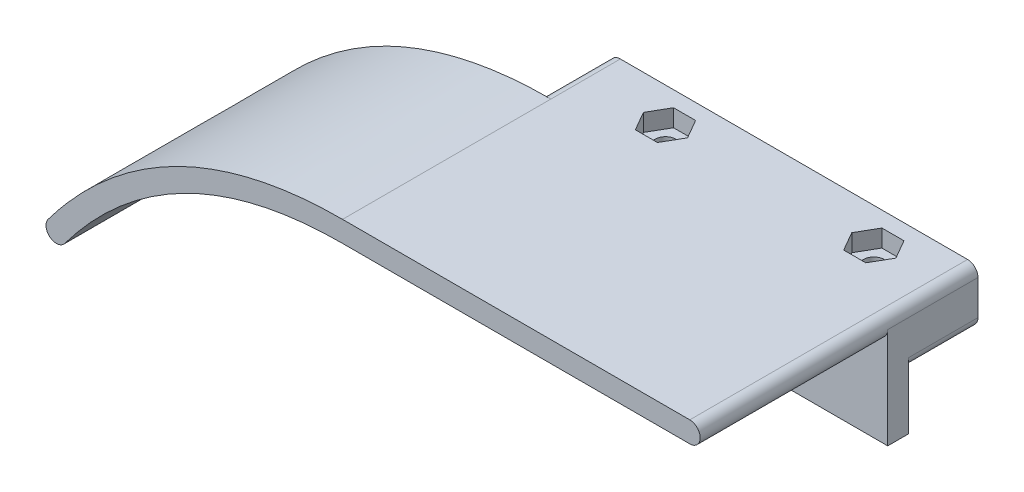
ISO-10303-21;
HEADER;
FILE_DESCRIPTION(('STEP AP214'),'2;1');
FILE_NAME('part.step','',(''),(''),'','','');
FILE_SCHEMA(('AUTOMOTIVE_DESIGN { 1 0 10303 214 1 1 1 1 }'));
ENDSEC;
DATA;
#1=APPLICATION_CONTEXT('core data for automotive mechanical design processes');
#2=APPLICATION_PROTOCOL_DEFINITION('international standard','automotive_design',2000,#1);
#3=PRODUCT_CONTEXT('',#1,'mechanical');
#4=PRODUCT('Part','Part','',(#3));
#5=PRODUCT_RELATED_PRODUCT_CATEGORY('part','',(#4));
#6=PRODUCT_DEFINITION_FORMATION('','',#4);
#7=PRODUCT_DEFINITION_CONTEXT('part definition',#1,'design');
#8=PRODUCT_DEFINITION('design','',#6,#7);
#9=PRODUCT_DEFINITION_SHAPE('','',#8);
#10=(LENGTH_UNIT() NAMED_UNIT(*) SI_UNIT(.MILLI.,.METRE.));
#11=(NAMED_UNIT(*) PLANE_ANGLE_UNIT() SI_UNIT($,.RADIAN.));
#12=(NAMED_UNIT(*) SI_UNIT($,.STERADIAN.) SOLID_ANGLE_UNIT());
#13=UNCERTAINTY_MEASURE_WITH_UNIT(LENGTH_MEASURE(1.E-05),#10,'distance_accuracy_value','');
#14=(GEOMETRIC_REPRESENTATION_CONTEXT(3) GLOBAL_UNCERTAINTY_ASSIGNED_CONTEXT((#13)) GLOBAL_UNIT_ASSIGNED_CONTEXT((#10,
#11,#12)) REPRESENTATION_CONTEXT('',''));
#15=CARTESIAN_POINT('',(0.,0.,0.));
#16=DIRECTION('',(0.,0.,1.));
#17=DIRECTION('',(1.,0.,0.));
#18=AXIS2_PLACEMENT_3D('',#15,#16,#17);
#19=CARTESIAN_POINT('',(-25.,1.5,30.));
#20=DIRECTION('',(0.,1.,0.));
#21=DIRECTION('',(0.,0.,1.));
#22=AXIS2_PLACEMENT_3D('',#19,#20,#21);
#23=PLANE('',#22);
#24=DIRECTION('',(1.,0.,0.));
#25=VECTOR('',#24,1.);
#26=CARTESIAN_POINT('',(-25.,1.5,-7.75000000000001));
#27=LINE('',#26,#25);
#28=CARTESIAN_POINT('',(14.9122867597285,1.5,-7.75));
#29=VERTEX_POINT('',#28);
#30=CARTESIAN_POINT('',(18.0877132402715,1.5,-7.75));
#31=VERTEX_POINT('',#30);
#32=EDGE_CURVE('E496',#29,#31,#27,.T.);
#33=ORIENTED_EDGE('',*,*,#32,.T.);
#34=DIRECTION('',(0.5,0.,0.866025403784438));
#35=VECTOR('',#34,1.);
#36=CARTESIAN_POINT('',(23.6620144266348,1.5,1.90497287147287));
#37=LINE('',#36,#35);
#38=CARTESIAN_POINT('',(19.6754264805429,1.5,-5.));
#39=VERTEX_POINT('',#38);
#40=EDGE_CURVE('E499',#31,#39,#37,.T.);
#41=ORIENTED_EDGE('',*,*,#40,.T.);
#42=DIRECTION('',(-0.499999999999999,0.,0.866025403784439));
#43=VECTOR('',#42,1.);
#44=CARTESIAN_POINT('',(-6.64887470582043,1.5,40.5950271285271));
#45=LINE('',#44,#43);
#46=CARTESIAN_POINT('',(18.0877132402715,1.5,-2.25));
#47=VERTEX_POINT('',#46);
#48=EDGE_CURVE('E480',#39,#47,#45,.T.);
#49=ORIENTED_EDGE('',*,*,#48,.T.);
#50=DIRECTION('',(-1.,0.,0.));
#51=VECTOR('',#50,1.);
#52=CARTESIAN_POINT('',(-25.,1.5,-2.24999999999999));
#53=LINE('',#52,#51);
#54=CARTESIAN_POINT('',(14.9122867597285,1.5,-2.25));
#55=VERTEX_POINT('',#54);
#56=EDGE_CURVE('E487',#47,#55,#53,.T.);
#57=ORIENTED_EDGE('',*,*,#56,.T.);
#58=DIRECTION('',(-0.5,0.,-0.866025403784439));
#59=VECTOR('',#58,1.);
#60=CARTESIAN_POINT('',(18.8988747058204,1.5,4.65497287147289));
#61=LINE('',#60,#59);
#62=CARTESIAN_POINT('',(13.324573519457,1.5,-5.));
#63=VERTEX_POINT('',#62);
#64=EDGE_CURVE('E490',#55,#63,#61,.T.);
#65=ORIENTED_EDGE('',*,*,#64,.T.);
#66=DIRECTION('',(0.5,0.,-0.866025403784439));
#67=VECTOR('',#66,1.);
#68=CARTESIAN_POINT('',(-11.4120144266349,1.5,37.8450271285271));
#69=LINE('',#68,#67);
#70=EDGE_CURVE('E493',#63,#29,#69,.T.);
#71=ORIENTED_EDGE('',*,*,#70,.T.);
#72=EDGE_LOOP('',(#33,#41,#49,#57,#65,#71));
#73=FACE_BOUND('',#72,.T.);
#74=DIRECTION('',(0.,0.,-1.));
#75=VECTOR('',#74,1.);
#76=CARTESIAN_POINT('',(25.,1.5,30.));
#77=LINE('',#76,#75);
#78=CARTESIAN_POINT('',(25.,1.5,30.));
#79=VERTEX_POINT('',#78);
#80=CARTESIAN_POINT('',(25.,1.5,-10.));
#81=VERTEX_POINT('',#80);
#82=EDGE_CURVE('E461',#79,#81,#77,.T.);
#83=ORIENTED_EDGE('',*,*,#82,.T.);
#84=DIRECTION('',(1.,0.,0.));
#85=VECTOR('',#84,1.);
#86=CARTESIAN_POINT('',(25.,1.5,-10.));
#87=LINE('',#86,#85);
#88=CARTESIAN_POINT('',(-25.,1.5,-10.));
#89=VERTEX_POINT('',#88);
#90=EDGE_CURVE('E337',#89,#81,#87,.T.);
#91=ORIENTED_EDGE('',*,*,#90,.F.);
#92=DIRECTION('',(0.,0.,1.));
#93=VECTOR('',#92,1.);
#94=CARTESIAN_POINT('',(-25.,1.5,-10.));
#95=LINE('',#94,#93);
#96=CARTESIAN_POINT('',(-25.,1.5,0.));
#97=VERTEX_POINT('',#96);
#98=EDGE_CURVE('E340',#89,#97,#95,.T.);
#99=ORIENTED_EDGE('',*,*,#98,.T.);
#100=DIRECTION('',(0.,0.,-1.));
#101=VECTOR('',#100,1.);
#102=CARTESIAN_POINT('',(-25.,1.5,30.));
#103=LINE('',#102,#101);
#104=CARTESIAN_POINT('',(-25.,1.5,30.));
#105=VERTEX_POINT('',#104);
#106=EDGE_CURVE('E450',#105,#97,#103,.T.);
#107=ORIENTED_EDGE('',*,*,#106,.F.);
#108=DIRECTION('',(1.,0.,0.));
#109=VECTOR('',#108,1.);
#110=CARTESIAN_POINT('',(-25.,1.5,30.));
#111=LINE('',#110,#109);
#112=EDGE_CURVE('E447',#105,#79,#111,.T.);
#113=ORIENTED_EDGE('',*,*,#112,.T.);
#114=EDGE_LOOP('',(#83,#91,#99,#107,#113));
#115=FACE_BOUND('',#114,.T.);
#116=DIRECTION('',(1.,0.,0.));
#117=VECTOR('',#116,1.);
#118=CARTESIAN_POINT('',(-25.,1.5,-7.75));
#119=LINE('',#118,#117);
#120=CARTESIAN_POINT('',(-15.0877132402715,1.5,-7.75));
#121=VERTEX_POINT('',#120);
#122=CARTESIAN_POINT('',(-11.9122867597285,1.5,-7.75));
#123=VERTEX_POINT('',#122);
#124=EDGE_CURVE('E514',#121,#123,#119,.T.);
#125=ORIENTED_EDGE('',*,*,#124,.T.);
#126=DIRECTION('',(0.5,0.,0.866025403784439));
#127=VECTOR('',#126,1.);
#128=CARTESIAN_POINT('',(1.16201442663487,1.5,14.8953539282395));
#129=LINE('',#128,#127);
#130=CARTESIAN_POINT('',(-10.3245735194571,1.5,-5.00000000000001));
#131=VERTEX_POINT('',#130);
#132=EDGE_CURVE('E238',#123,#131,#129,.T.);
#133=ORIENTED_EDGE('',*,*,#132,.T.);
#134=DIRECTION('',(-0.5,0.,0.866025403784439));
#135=VECTOR('',#134,1.);
#136=CARTESIAN_POINT('',(-29.1488747058205,1.5,27.6046460717605));
#137=LINE('',#136,#135);
#138=CARTESIAN_POINT('',(-11.9122867597285,1.5,-2.25));
#139=VERTEX_POINT('',#138);
#140=EDGE_CURVE('E502',#131,#139,#137,.T.);
#141=ORIENTED_EDGE('',*,*,#140,.T.);
#142=DIRECTION('',(-1.,0.,0.));
#143=VECTOR('',#142,1.);
#144=CARTESIAN_POINT('',(-25.,1.5,-2.25));
#145=LINE('',#144,#143);
#146=CARTESIAN_POINT('',(-15.0877132402715,1.5,-2.25));
#147=VERTEX_POINT('',#146);
#148=EDGE_CURVE('E505',#139,#147,#145,.T.);
#149=ORIENTED_EDGE('',*,*,#148,.T.);
#150=DIRECTION('',(-0.5,0.,-0.866025403784439));
#151=VECTOR('',#150,1.);
#152=CARTESIAN_POINT('',(-3.60112529417956,1.5,17.6453539282395));
#153=LINE('',#152,#151);
#154=CARTESIAN_POINT('',(-16.675426480543,1.5,-5.));
#155=VERTEX_POINT('',#154);
#156=EDGE_CURVE('E508',#147,#155,#153,.T.);
#157=ORIENTED_EDGE('',*,*,#156,.T.);
#158=DIRECTION('',(0.5,0.,-0.866025403784439));
#159=VECTOR('',#158,1.);
#160=CARTESIAN_POINT('',(-33.9120144266349,1.5,24.8546460717605));
#161=LINE('',#160,#159);
#162=EDGE_CURVE('E511',#155,#121,#161,.T.);
#163=ORIENTED_EDGE('',*,*,#162,.T.);
#164=EDGE_LOOP('',(#125,#133,#141,#149,#157,#163));
#165=FACE_BOUND('',#164,.T.);
#166=ADVANCED_FACE('F39',(#73,#115,#165),#23,.T.);
#167=CARTESIAN_POINT('',(16.5,-22.1,-5.));
#168=DIRECTION('',(0.,1.,0.));
#169=DIRECTION('',(0.,0.,1.));
#170=AXIS2_PLACEMENT_3D('',#167,#168,#169);
#171=CYLINDRICAL_SURFACE('',#170,1.5);
#172=CARTESIAN_POINT('',(16.5,-6.5,-5.));
#173=DIRECTION('',(0.,1.,0.));
#174=DIRECTION('',(0.,0.,1.));
#175=AXIS2_PLACEMENT_3D('',#172,#173,#174);
#176=CIRCLE('',#175,1.5);
#177=CARTESIAN_POINT('',(16.5,-6.5,-3.5));
#178=VERTEX_POINT('',#177);
#179=EDGE_CURVE('E320',#178,#178,#176,.T.);
#180=ORIENTED_EDGE('',*,*,#179,.F.);
#181=EDGE_LOOP('',(#180));
#182=FACE_BOUND('',#181,.T.);
#183=CARTESIAN_POINT('',(16.5,-1.,-5.));
#184=DIRECTION('',(0.,1.,0.));
#185=DIRECTION('',(0.,0.,1.));
#186=AXIS2_PLACEMENT_3D('',#183,#184,#185);
#187=CIRCLE('',#186,1.5);
#188=CARTESIAN_POINT('',(16.5,-1.,-3.5));
#189=VERTEX_POINT('',#188);
#190=EDGE_CURVE('E310',#189,#189,#187,.F.);
#191=ORIENTED_EDGE('',*,*,#190,.F.);
#192=EDGE_LOOP('',(#191));
#193=FACE_BOUND('',#192,.T.);
#194=ADVANCED_FACE('F561',(#182,#193),#171,.F.);
#195=CARTESIAN_POINT('',(-13.5,-22.1,-5.));
#196=DIRECTION('',(0.,1.,0.));
#197=DIRECTION('',(0.,0.,1.));
#198=AXIS2_PLACEMENT_3D('',#195,#196,#197);
#199=CYLINDRICAL_SURFACE('',#198,1.5);
#200=CARTESIAN_POINT('',(-13.5,-6.5,-5.));
#201=DIRECTION('',(0.,1.,0.));
#202=DIRECTION('',(0.,0.,1.));
#203=AXIS2_PLACEMENT_3D('',#200,#201,#202);
#204=CIRCLE('',#203,1.5);
#205=CARTESIAN_POINT('',(-13.5,-6.5,-3.5));
#206=VERTEX_POINT('',#205);
#207=EDGE_CURVE('E345',#206,#206,#204,.T.);
#208=ORIENTED_EDGE('',*,*,#207,.F.);
#209=EDGE_LOOP('',(#208));
#210=FACE_BOUND('',#209,.T.);
#211=CARTESIAN_POINT('',(-13.5,-1.,-5.));
#212=DIRECTION('',(0.,1.,0.));
#213=DIRECTION('',(0.,0.,1.));
#214=AXIS2_PLACEMENT_3D('',#211,#212,#213);
#215=CIRCLE('',#214,1.5);
#216=CARTESIAN_POINT('',(-13.5,-1.,-3.5));
#217=VERTEX_POINT('',#216);
#218=EDGE_CURVE('E241',#217,#217,#215,.F.);
#219=ORIENTED_EDGE('',*,*,#218,.F.);
#220=EDGE_LOOP('',(#219));
#221=FACE_BOUND('',#220,.T.);
#222=ADVANCED_FACE('F427',(#210,#221),#199,.F.);
#223=CARTESIAN_POINT('',(-66.2,-20.6,30.));
#224=DIRECTION('',(0.,0.,-1.));
#225=DIRECTION('',(-1.,0.,0.));
#226=AXIS2_PLACEMENT_3D('',#223,#224,#225);
#227=CYLINDRICAL_SURFACE('',#226,1.5);
#228=CARTESIAN_POINT('',(-66.2,-20.6,3.));
#229=DIRECTION('',(0.,0.,-1.));
#230=DIRECTION('',(-1.,0.,0.));
#231=AXIS2_PLACEMENT_3D('',#228,#229,#230);
#232=CIRCLE('',#231,1.5);
#233=CARTESIAN_POINT('',(-65.,-21.5,3.));
#234=VERTEX_POINT('',#233);
#235=CARTESIAN_POINT('',(-66.2,-22.1,3.));
#236=VERTEX_POINT('',#235);
#237=EDGE_CURVE('E398',#234,#236,#232,.T.);
#238=ORIENTED_EDGE('',*,*,#237,.F.);
#239=DIRECTION('',(0.,0.,-1.));
#240=VECTOR('',#239,1.);
#241=CARTESIAN_POINT('',(-65.,-21.5,30.));
#242=LINE('',#241,#240);
#243=CARTESIAN_POINT('',(-65.,-21.5,30.));
#244=VERTEX_POINT('',#243);
#245=EDGE_CURVE('E469',#244,#234,#242,.T.);
#246=ORIENTED_EDGE('',*,*,#245,.F.);
#247=CARTESIAN_POINT('',(-66.2,-20.6,30.));
#248=DIRECTION('',(0.,0.,1.));
#249=DIRECTION('',(1.,0.,0.));
#250=AXIS2_PLACEMENT_3D('',#247,#248,#249);
#251=CIRCLE('',#250,1.5);
#252=CARTESIAN_POINT('',(-67.4,-19.7,30.));
#253=VERTEX_POINT('',#252);
#254=EDGE_CURVE('E411',#253,#244,#251,.T.);
#255=ORIENTED_EDGE('',*,*,#254,.F.);
#256=DIRECTION('',(0.,0.,-1.));
#257=VECTOR('',#256,1.);
#258=CARTESIAN_POINT('',(-67.4,-19.7,30.));
#259=LINE('',#258,#257);
#260=CARTESIAN_POINT('',(-67.4,-19.7,0.));
#261=VERTEX_POINT('',#260);
#262=EDGE_CURVE('E472',#253,#261,#259,.T.);
#263=ORIENTED_EDGE('',*,*,#262,.T.);
#264=CARTESIAN_POINT('',(-66.2,-20.6,0.));
#265=DIRECTION('',(0.,0.,1.));
#266=DIRECTION('',(1.,0.,0.));
#267=AXIS2_PLACEMENT_3D('',#264,#265,#266);
#268=CIRCLE('',#267,1.5);
#269=CARTESIAN_POINT('',(-66.2,-22.1,0.));
#270=VERTEX_POINT('',#269);
#271=EDGE_CURVE('E412',#261,#270,#268,.T.);
#272=ORIENTED_EDGE('',*,*,#271,.T.);
#273=DIRECTION('',(0.,0.,-1.));
#274=VECTOR('',#273,1.);
#275=CARTESIAN_POINT('',(-66.2,-22.1,3.));
#276=LINE('',#275,#274);
#277=EDGE_CURVE('E384',#236,#270,#276,.T.);
#278=ORIENTED_EDGE('',*,*,#277,.F.);
#279=EDGE_LOOP('',(#238,#246,#255,#263,#272,#278));
#280=FACE_BOUND('',#279,.T.);
#281=ADVANCED_FACE('F423',(#280),#227,.T.);
#282=CARTESIAN_POINT('',(-25.,-1.5,30.));
#283=CARTESIAN_POINT('',(-50.,-1.5,30.));
#284=CARTESIAN_POINT('',(-65.,-21.5,30.));
#285=B_SPLINE_CURVE_WITH_KNOTS('',2,(#282,#283,#284),.UNSPECIFIED.,.F.,.F.,(3,3),(0.,1.),.UNSPECIFIED.);
#286=DIRECTION('',(0.,0.,-1.));
#287=VECTOR('',#286,1.);
#288=SURFACE_OF_LINEAR_EXTRUSION('',#285,#287);
#289=ORIENTED_EDGE('',*,*,#245,.T.);
#290=CARTESIAN_POINT('',(-25.,-1.5,3.));
#291=CARTESIAN_POINT('',(-50.,-1.5,3.));
#292=CARTESIAN_POINT('',(-65.,-21.5,3.));
#293=B_SPLINE_CURVE_WITH_KNOTS('',2,(#290,#291,#292),.UNSPECIFIED.,.F.,.F.,(3,3),(0.,1.),.UNSPECIFIED.);
#294=CARTESIAN_POINT('',(-25.,-1.5,3.));
#295=VERTEX_POINT('',#294);
#296=EDGE_CURVE('E393',#234,#295,#293,.F.);
#297=ORIENTED_EDGE('',*,*,#296,.T.);
#298=DIRECTION('',(0.,0.,-1.));
#299=VECTOR('',#298,1.);
#300=CARTESIAN_POINT('',(-25.,-1.5,30.));
#301=LINE('',#300,#299);
#302=CARTESIAN_POINT('',(-25.,-1.5,30.));
#303=VERTEX_POINT('',#302);
#304=EDGE_CURVE('E466',#303,#295,#301,.T.);
#305=ORIENTED_EDGE('',*,*,#304,.F.);
#306=EDGE_CURVE('E433',#303,#244,#285,.T.);
#307=ORIENTED_EDGE('',*,*,#306,.T.);
#308=EDGE_LOOP('',(#289,#297,#305,#307));
#309=FACE_BOUND('',#308,.T.);
#310=ADVANCED_FACE('F426',(#309),#288,.T.);
#311=CARTESIAN_POINT('',(-25.,-1.5,30.));
#312=DIRECTION('',(0.,1.,0.));
#313=DIRECTION('',(0.,0.,1.));
#314=AXIS2_PLACEMENT_3D('',#311,#312,#313);
#315=PLANE('',#314);
#316=DIRECTION('',(-1.,0.,0.));
#317=VECTOR('',#316,1.);
#318=CARTESIAN_POINT('',(-25.,-1.5,3.));
#319=LINE('',#318,#317);
#320=CARTESIAN_POINT('',(25.,-1.5,3.));
#321=VERTEX_POINT('',#320);
#322=EDGE_CURVE('E391',#321,#295,#319,.T.);
#323=ORIENTED_EDGE('',*,*,#322,.F.);
#324=DIRECTION('',(0.,0.,-1.));
#325=VECTOR('',#324,1.);
#326=CARTESIAN_POINT('',(25.,-1.5,30.));
#327=LINE('',#326,#325);
#328=CARTESIAN_POINT('',(25.,-1.5,30.));
#329=VERTEX_POINT('',#328);
#330=EDGE_CURVE('E463',#329,#321,#327,.T.);
#331=ORIENTED_EDGE('',*,*,#330,.F.);
#332=DIRECTION('',(1.,0.,0.));
#333=VECTOR('',#332,1.);
#334=CARTESIAN_POINT('',(-25.,-1.5,30.));
#335=LINE('',#334,#333);
#336=EDGE_CURVE('E439',#303,#329,#335,.T.);
#337=ORIENTED_EDGE('',*,*,#336,.F.);
#338=ORIENTED_EDGE('',*,*,#304,.T.);
#339=EDGE_LOOP('',(#323,#331,#337,#338));
#340=FACE_BOUND('',#339,.T.);
#341=ADVANCED_FACE('F421',(#340),#315,.F.);
#342=CARTESIAN_POINT('',(-25.,1.5,30.));
#343=CARTESIAN_POINT('',(-34.8412354794874,1.51154344161024,30.));
#344=CARTESIAN_POINT('',(-49.0088348649895,-3.4823302700211,30.));
#345=CARTESIAN_POINT('',(-61.5044934655958,-11.820085551444,30.));
#346=CARTESIAN_POINT('',(-67.4,-19.7,30.));
#347=B_SPLINE_CURVE_WITH_KNOTS('',2,(#342,#343,#344,#345,#346),.UNSPECIFIED.,.F.,.F.,(3,1,1,3),
(0.,0.375,0.625,1.),.UNSPECIFIED.);
#348=DIRECTION('',(0.,0.,-1.));
#349=VECTOR('',#348,1.);
#350=SURFACE_OF_LINEAR_EXTRUSION('',#347,#349);
#351=CARTESIAN_POINT('',(-25.,1.5,0.));
#352=CARTESIAN_POINT('',(-34.8412354794874,1.51154344161024,0.));
#353=CARTESIAN_POINT('',(-49.0088348649895,-3.4823302700211,0.));
#354=CARTESIAN_POINT('',(-61.5044934655958,-11.820085551444,0.));
#355=CARTESIAN_POINT('',(-67.4,-19.7,0.));
#356=B_SPLINE_CURVE_WITH_KNOTS('',2,(#351,#352,#353,#354,#355),.UNSPECIFIED.,.F.,.F.,(3,1,1,3),
(0.,0.375,0.625,1.),.UNSPECIFIED.);
#357=EDGE_CURVE('E404',#97,#261,#356,.T.);
#358=ORIENTED_EDGE('',*,*,#357,.T.);
#359=ORIENTED_EDGE('',*,*,#262,.F.);
#360=EDGE_CURVE('E405',#105,#253,#347,.T.);
#361=ORIENTED_EDGE('',*,*,#360,.F.);
#362=ORIENTED_EDGE('',*,*,#106,.T.);
#363=EDGE_LOOP('',(#358,#359,#361,#362));
#364=FACE_BOUND('',#363,.T.);
#365=ADVANCED_FACE('F417',(#364),#350,.F.);
#366=CARTESIAN_POINT('',(25.,0.,30.));
#367=DIRECTION('',(0.,0.,-1.));
#368=DIRECTION('',(-1.,0.,0.));
#369=AXIS2_PLACEMENT_3D('',#366,#367,#368);
#370=CYLINDRICAL_SURFACE('',#369,1.5);
#371=DIRECTION('',(0.,0.,-1.));
#372=VECTOR('',#371,1.);
#373=CARTESIAN_POINT('',(26.5,0.,3.));
#374=LINE('',#373,#372);
#375=CARTESIAN_POINT('',(26.5,0.,3.));
#376=VERTEX_POINT('',#375);
#377=CARTESIAN_POINT('',(26.5,0.,-10.));
#378=VERTEX_POINT('',#377);
#379=EDGE_CURVE('E380',#376,#378,#374,.T.);
#380=ORIENTED_EDGE('',*,*,#379,.T.);
#381=CARTESIAN_POINT('',(25.,0.,-10.));
#382=DIRECTION('',(0.,0.,-1.));
#383=DIRECTION('',(-1.,0.,0.));
#384=AXIS2_PLACEMENT_3D('',#381,#382,#383);
#385=CIRCLE('',#384,1.5);
#386=EDGE_CURVE('E321',#81,#378,#385,.T.);
#387=ORIENTED_EDGE('',*,*,#386,.F.);
#388=ORIENTED_EDGE('',*,*,#82,.F.);
#389=CARTESIAN_POINT('',(25.,0.,30.));
#390=DIRECTION('',(0.,0.,-1.));
#391=DIRECTION('',(-1.,0.,0.));
#392=AXIS2_PLACEMENT_3D('',#389,#390,#391);
#393=CIRCLE('',#392,1.5);
#394=EDGE_CURVE('E444',#79,#329,#393,.T.);
#395=ORIENTED_EDGE('',*,*,#394,.T.);
#396=ORIENTED_EDGE('',*,*,#330,.T.);
#397=CARTESIAN_POINT('',(25.,0.,3.));
#398=DIRECTION('',(0.,0.,-1.));
#399=DIRECTION('',(-1.,0.,0.));
#400=AXIS2_PLACEMENT_3D('',#397,#398,#399);
#401=CIRCLE('',#400,1.5);
#402=EDGE_CURVE('E387',#321,#376,#401,.F.);
#403=ORIENTED_EDGE('',*,*,#402,.T.);
#404=EDGE_LOOP('',(#380,#387,#388,#395,#396,#403));
#405=FACE_BOUND('',#404,.T.);
#406=ADVANCED_FACE('F420',(#405),#370,.T.);
#407=CARTESIAN_POINT('',(-48.8416407864999,-3.81671842700025,30.));
#408=DIRECTION('',(0.,0.,-1.));
#409=DIRECTION('',(-1.,0.,0.));
#410=AXIS2_PLACEMENT_3D('',#407,#408,#409);
#411=PLANE('',#410);
#412=ORIENTED_EDGE('',*,*,#360,.T.);
#413=ORIENTED_EDGE('',*,*,#254,.T.);
#414=ORIENTED_EDGE('',*,*,#306,.F.);
#415=ORIENTED_EDGE('',*,*,#336,.T.);
#416=ORIENTED_EDGE('',*,*,#394,.F.);
#417=ORIENTED_EDGE('',*,*,#112,.F.);
#418=EDGE_LOOP('',(#412,#413,#414,#415,#416,#417));
#419=FACE_BOUND('',#418,.T.);
#420=ADVANCED_FACE('F573',(#419),#411,.F.);
#421=CARTESIAN_POINT('',(-48.8416407864999,-3.81671842700025,0.));
#422=DIRECTION('',(0.,0.,-1.));
#423=DIRECTION('',(-1.,0.,0.));
#424=AXIS2_PLACEMENT_3D('',#421,#422,#423);
#425=PLANE('',#424);
#426=CARTESIAN_POINT('',(-33.5,-22.1,0.));
#427=DIRECTION('',(0.,0.,-1.));
#428=DIRECTION('',(1.,0.,0.));
#429=AXIS2_PLACEMENT_3D('',#426,#427,#428);
#430=CIRCLE('',#429,7.60000000000001);
#431=CARTESIAN_POINT('',(-40.9332399097268,-20.5166666666667,0.));
#432=VERTEX_POINT('',#431);
#433=CARTESIAN_POINT('',(-33.5,-14.5,0.));
#434=VERTEX_POINT('',#433);
#435=EDGE_CURVE('E307',#432,#434,#430,.T.);
#436=ORIENTED_EDGE('',*,*,#435,.F.);
#437=CARTESIAN_POINT('',(-42.8893556754444,-20.1,0.));
#438=DIRECTION('',(0.,0.,-1.));
#439=DIRECTION('',(-1.,0.,0.));
#440=AXIS2_PLACEMENT_3D('',#437,#438,#439);
#441=CIRCLE('',#440,2.);
#442=CARTESIAN_POINT('',(-42.8893556754444,-22.1,0.));
#443=VERTEX_POINT('',#442);
#444=EDGE_CURVE('E61',#432,#443,#441,.T.);
#445=ORIENTED_EDGE('',*,*,#444,.T.);
#446=DIRECTION('',(-1.,0.,0.));
#447=VECTOR('',#446,1.);
#448=CARTESIAN_POINT('',(-66.2,-22.1,0.));
#449=LINE('',#448,#447);
#450=EDGE_CURVE('E378',#443,#270,#449,.T.);
#451=ORIENTED_EDGE('',*,*,#450,.T.);
#452=ORIENTED_EDGE('',*,*,#271,.F.);
#453=ORIENTED_EDGE('',*,*,#357,.F.);
#454=CARTESIAN_POINT('',(-25.,0.,0.));
#455=DIRECTION('',(0.,0.,-1.));
#456=DIRECTION('',(-1.,0.,0.));
#457=AXIS2_PLACEMENT_3D('',#454,#455,#456);
#458=CIRCLE('',#457,1.5);
#459=CARTESIAN_POINT('',(-26.5,0.,0.));
#460=VERTEX_POINT('',#459);
#461=EDGE_CURVE('E325',#460,#97,#458,.T.);
#462=ORIENTED_EDGE('',*,*,#461,.F.);
#463=DIRECTION('',(0.,1.,0.));
#464=VECTOR('',#463,1.);
#465=CARTESIAN_POINT('',(-26.5,0.,0.));
#466=LINE('',#465,#464);
#467=CARTESIAN_POINT('',(-26.5,-5.,0.));
#468=VERTEX_POINT('',#467);
#469=EDGE_CURVE('E351',#468,#460,#466,.T.);
#470=ORIENTED_EDGE('',*,*,#469,.F.);
#471=CARTESIAN_POINT('',(-25.,-5.,0.));
#472=DIRECTION('',(0.,0.,-1.));
#473=DIRECTION('',(-1.,0.,0.));
#474=AXIS2_PLACEMENT_3D('',#471,#472,#473);
#475=CIRCLE('',#474,1.5);
#476=CARTESIAN_POINT('',(-25.,-6.5,0.));
#477=VERTEX_POINT('',#476);
#478=EDGE_CURVE('E348',#477,#468,#475,.T.);
#479=ORIENTED_EDGE('',*,*,#478,.F.);
#480=DIRECTION('',(-1.,0.,0.));
#481=VECTOR('',#480,1.);
#482=CARTESIAN_POINT('',(25.,-6.5,0.));
#483=LINE('',#482,#481);
#484=CARTESIAN_POINT('',(25.,-6.5,0.));
#485=VERTEX_POINT('',#484);
#486=EDGE_CURVE('E344',#485,#477,#483,.T.);
#487=ORIENTED_EDGE('',*,*,#486,.F.);
#488=CARTESIAN_POINT('',(25.,-5.,0.));
#489=DIRECTION('',(0.,0.,-1.));
#490=DIRECTION('',(-1.,0.,0.));
#491=AXIS2_PLACEMENT_3D('',#488,#489,#490);
#492=CIRCLE('',#491,1.5);
#493=CARTESIAN_POINT('',(26.5,-5.,0.));
#494=VERTEX_POINT('',#493);
#495=EDGE_CURVE('E341',#494,#485,#492,.T.);
#496=ORIENTED_EDGE('',*,*,#495,.F.);
#497=DIRECTION('',(0.,-1.,0.));
#498=VECTOR('',#497,1.);
#499=CARTESIAN_POINT('',(26.5,0.,0.));
#500=LINE('',#499,#498);
#501=CARTESIAN_POINT('',(26.5,-14.5,0.));
#502=VERTEX_POINT('',#501);
#503=EDGE_CURVE('E373',#494,#502,#500,.T.);
#504=ORIENTED_EDGE('',*,*,#503,.T.);
#505=DIRECTION('',(1.,0.,0.));
#506=VECTOR('',#505,1.);
#507=CARTESIAN_POINT('',(26.5,-14.5,0.));
#508=LINE('',#507,#506);
#509=EDGE_CURVE('E309',#434,#502,#508,.T.);
#510=ORIENTED_EDGE('',*,*,#509,.F.);
#511=EDGE_LOOP('',(#436,#445,#451,#452,#453,#462,#470,#479,#487,#496,#504,#510));
#512=FACE_BOUND('',#511,.T.);
#513=ADVANCED_FACE('F528',(#512),#425,.T.);
#514=CARTESIAN_POINT('',(-48.8416407864999,-3.81671842700025,3.));
#515=DIRECTION('',(0.,0.,-1.));
#516=DIRECTION('',(-1.,0.,0.));
#517=AXIS2_PLACEMENT_3D('',#514,#515,#516);
#518=PLANE('',#517);
#519=DIRECTION('',(-1.,0.,0.));
#520=VECTOR('',#519,1.);
#521=CARTESIAN_POINT('',(-66.2,-22.1,3.));
#522=LINE('',#521,#520);
#523=CARTESIAN_POINT('',(-42.8893556754444,-22.1,3.));
#524=VERTEX_POINT('',#523);
#525=EDGE_CURVE('E377',#524,#236,#522,.T.);
#526=ORIENTED_EDGE('',*,*,#525,.F.);
#527=CARTESIAN_POINT('',(-42.8893556754444,-20.1,3.));
#528=DIRECTION('',(0.,0.,-1.));
#529=DIRECTION('',(-1.,0.,0.));
#530=AXIS2_PLACEMENT_3D('',#527,#528,#529);
#531=CIRCLE('',#530,2.);
#532=CARTESIAN_POINT('',(-40.9332399097268,-20.5166666666667,3.));
#533=VERTEX_POINT('',#532);
#534=EDGE_CURVE('E11',#524,#533,#531,.F.);
#535=ORIENTED_EDGE('',*,*,#534,.T.);
#536=CARTESIAN_POINT('',(-33.5,-22.1,3.));
#537=DIRECTION('',(0.,0.,-1.));
#538=DIRECTION('',(-1.,0.,0.));
#539=AXIS2_PLACEMENT_3D('',#536,#537,#538);
#540=CIRCLE('',#539,7.60000000000001);
#541=CARTESIAN_POINT('',(-33.5,-14.5,3.));
#542=VERTEX_POINT('',#541);
#543=EDGE_CURVE('E318',#533,#542,#540,.T.);
#544=ORIENTED_EDGE('',*,*,#543,.T.);
#545=DIRECTION('',(1.,0.,0.));
#546=VECTOR('',#545,1.);
#547=CARTESIAN_POINT('',(-48.8416407864999,-14.5,3.));
#548=LINE('',#547,#546);
#549=CARTESIAN_POINT('',(26.5,-14.5,3.));
#550=VERTEX_POINT('',#549);
#551=EDGE_CURVE('E315',#542,#550,#548,.T.);
#552=ORIENTED_EDGE('',*,*,#551,.T.);
#553=DIRECTION('',(0.,-1.,0.));
#554=VECTOR('',#553,1.);
#555=CARTESIAN_POINT('',(26.5,0.,3.));
#556=LINE('',#555,#554);
#557=EDGE_CURVE('E374',#376,#550,#556,.T.);
#558=ORIENTED_EDGE('',*,*,#557,.F.);
#559=ORIENTED_EDGE('',*,*,#402,.F.);
#560=ORIENTED_EDGE('',*,*,#322,.T.);
#561=ORIENTED_EDGE('',*,*,#296,.F.);
#562=ORIENTED_EDGE('',*,*,#237,.T.);
#563=EDGE_LOOP('',(#526,#535,#544,#552,#558,#559,#560,#561,#562));
#564=FACE_BOUND('',#563,.T.);
#565=ADVANCED_FACE('F540',(#564),#518,.F.);
#566=CARTESIAN_POINT('',(-66.2,-22.1,3.));
#567=DIRECTION('',(0.,-1.,0.));
#568=DIRECTION('',(1.,0.,0.));
#569=AXIS2_PLACEMENT_3D('',#566,#567,#568);
#570=PLANE('',#569);
#571=ORIENTED_EDGE('',*,*,#450,.F.);
#572=DIRECTION('',(0.,0.,1.));
#573=VECTOR('',#572,1.);
#574=CARTESIAN_POINT('',(-42.8893556754444,-22.1,3.));
#575=LINE('',#574,#573);
#576=EDGE_CURVE('E47',#443,#524,#575,.T.);
#577=ORIENTED_EDGE('',*,*,#576,.T.);
#578=ORIENTED_EDGE('',*,*,#525,.T.);
#579=ORIENTED_EDGE('',*,*,#277,.T.);
#580=EDGE_LOOP('',(#571,#577,#578,#579));
#581=FACE_BOUND('',#580,.T.);
#582=ADVANCED_FACE('F585',(#581),#570,.T.);
#583=CARTESIAN_POINT('',(26.5,0.,3.));
#584=DIRECTION('',(1.,0.,0.));
#585=DIRECTION('',(0.,1.,0.));
#586=AXIS2_PLACEMENT_3D('',#583,#584,#585);
#587=PLANE('',#586);
#588=DIRECTION('',(0.,0.,1.));
#589=VECTOR('',#588,1.);
#590=CARTESIAN_POINT('',(26.5,-14.5,3.));
#591=LINE('',#590,#589);
#592=EDGE_CURVE('E474',#502,#550,#591,.T.);
#593=ORIENTED_EDGE('',*,*,#592,.F.);
#594=ORIENTED_EDGE('',*,*,#503,.F.);
#595=DIRECTION('',(0.,0.,1.));
#596=VECTOR('',#595,1.);
#597=CARTESIAN_POINT('',(26.5,-5.,-10.));
#598=LINE('',#597,#596);
#599=CARTESIAN_POINT('',(26.5,-5.,-10.));
#600=VERTEX_POINT('',#599);
#601=EDGE_CURVE('E370',#600,#494,#598,.T.);
#602=ORIENTED_EDGE('',*,*,#601,.F.);
#603=DIRECTION('',(0.,-1.,0.));
#604=VECTOR('',#603,1.);
#605=CARTESIAN_POINT('',(26.5,0.,-10.));
#606=LINE('',#605,#604);
#607=EDGE_CURVE('E324',#378,#600,#606,.T.);
#608=ORIENTED_EDGE('',*,*,#607,.F.);
#609=ORIENTED_EDGE('',*,*,#379,.F.);
#610=ORIENTED_EDGE('',*,*,#557,.T.);
#611=EDGE_LOOP('',(#593,#594,#602,#608,#609,#610));
#612=FACE_BOUND('',#611,.T.);
#613=ADVANCED_FACE('F535',(#612),#587,.T.);
#614=CARTESIAN_POINT('',(25.,-5.,-10.));
#615=DIRECTION('',(0.,0.,1.));
#616=DIRECTION('',(1.,0.,0.));
#617=AXIS2_PLACEMENT_3D('',#614,#615,#616);
#618=CYLINDRICAL_SURFACE('',#617,1.5);
#619=ORIENTED_EDGE('',*,*,#495,.T.);
#620=DIRECTION('',(0.,0.,1.));
#621=VECTOR('',#620,1.);
#622=CARTESIAN_POINT('',(25.,-6.5,-10.));
#623=LINE('',#622,#621);
#624=CARTESIAN_POINT('',(25.,-6.5,-10.));
#625=VERTEX_POINT('',#624);
#626=EDGE_CURVE('E367',#625,#485,#623,.T.);
#627=ORIENTED_EDGE('',*,*,#626,.F.);
#628=CARTESIAN_POINT('',(25.,-5.,-10.));
#629=DIRECTION('',(0.,0.,-1.));
#630=DIRECTION('',(-1.,0.,0.));
#631=AXIS2_PLACEMENT_3D('',#628,#629,#630);
#632=CIRCLE('',#631,1.5);
#633=EDGE_CURVE('E327',#600,#625,#632,.T.);
#634=ORIENTED_EDGE('',*,*,#633,.F.);
#635=ORIENTED_EDGE('',*,*,#601,.T.);
#636=EDGE_LOOP('',(#619,#627,#634,#635));
#637=FACE_BOUND('',#636,.T.);
#638=ADVANCED_FACE('F584',(#637),#618,.T.);
#639=CARTESIAN_POINT('',(25.,-6.5,-10.));
#640=DIRECTION('',(0.,1.,0.));
#641=DIRECTION('',(0.,0.,1.));
#642=AXIS2_PLACEMENT_3D('',#639,#640,#641);
#643=PLANE('',#642);
#644=ORIENTED_EDGE('',*,*,#207,.T.);
#645=EDGE_LOOP('',(#644));
#646=FACE_BOUND('',#645,.T.);
#647=ORIENTED_EDGE('',*,*,#179,.T.);
#648=EDGE_LOOP('',(#647));
#649=FACE_BOUND('',#648,.T.);
#650=ORIENTED_EDGE('',*,*,#486,.T.);
#651=DIRECTION('',(0.,0.,1.));
#652=VECTOR('',#651,1.);
#653=CARTESIAN_POINT('',(-25.,-6.5,-10.));
#654=LINE('',#653,#652);
#655=CARTESIAN_POINT('',(-25.,-6.5,-10.));
#656=VERTEX_POINT('',#655);
#657=EDGE_CURVE('E364',#656,#477,#654,.T.);
#658=ORIENTED_EDGE('',*,*,#657,.F.);
#659=DIRECTION('',(-1.,0.,0.));
#660=VECTOR('',#659,1.);
#661=CARTESIAN_POINT('',(25.,-6.5,-10.));
#662=LINE('',#661,#660);
#663=EDGE_CURVE('E329',#625,#656,#662,.T.);
#664=ORIENTED_EDGE('',*,*,#663,.F.);
#665=ORIENTED_EDGE('',*,*,#626,.T.);
#666=EDGE_LOOP('',(#650,#658,#664,#665));
#667=FACE_BOUND('',#666,.T.);
#668=ADVANCED_FACE('F592',(#646,#649,#667),#643,.F.);
#669=CARTESIAN_POINT('',(-25.,-5.,-10.));
#670=DIRECTION('',(0.,0.,1.));
#671=DIRECTION('',(1.,0.,0.));
#672=AXIS2_PLACEMENT_3D('',#669,#670,#671);
#673=CYLINDRICAL_SURFACE('',#672,1.5);
#674=ORIENTED_EDGE('',*,*,#478,.T.);
#675=DIRECTION('',(0.,0.,1.));
#676=VECTOR('',#675,1.);
#677=CARTESIAN_POINT('',(-26.5,-5.,-10.));
#678=LINE('',#677,#676);
#679=CARTESIAN_POINT('',(-26.5,-5.,-10.));
#680=VERTEX_POINT('',#679);
#681=EDGE_CURVE('E361',#680,#468,#678,.T.);
#682=ORIENTED_EDGE('',*,*,#681,.F.);
#683=CARTESIAN_POINT('',(-25.,-5.,-10.));
#684=DIRECTION('',(0.,0.,-1.));
#685=DIRECTION('',(-1.,0.,0.));
#686=AXIS2_PLACEMENT_3D('',#683,#684,#685);
#687=CIRCLE('',#686,1.5);
#688=EDGE_CURVE('E331',#656,#680,#687,.T.);
#689=ORIENTED_EDGE('',*,*,#688,.F.);
#690=ORIENTED_EDGE('',*,*,#657,.T.);
#691=EDGE_LOOP('',(#674,#682,#689,#690));
#692=FACE_BOUND('',#691,.T.);
#693=ADVANCED_FACE('F596',(#692),#673,.T.);
#694=CARTESIAN_POINT('',(-26.5,0.,-10.));
#695=DIRECTION('',(1.,0.,0.));
#696=DIRECTION('',(0.,1.,0.));
#697=AXIS2_PLACEMENT_3D('',#694,#695,#696);
#698=PLANE('',#697);
#699=ORIENTED_EDGE('',*,*,#469,.T.);
#700=DIRECTION('',(0.,0.,1.));
#701=VECTOR('',#700,1.);
#702=CARTESIAN_POINT('',(-26.5,0.,-10.));
#703=LINE('',#702,#701);
#704=CARTESIAN_POINT('',(-26.5,0.,-10.));
#705=VERTEX_POINT('',#704);
#706=EDGE_CURVE('E358',#705,#460,#703,.T.);
#707=ORIENTED_EDGE('',*,*,#706,.F.);
#708=DIRECTION('',(0.,1.,0.));
#709=VECTOR('',#708,1.);
#710=CARTESIAN_POINT('',(-26.5,0.,-10.));
#711=LINE('',#710,#709);
#712=EDGE_CURVE('E333',#680,#705,#711,.T.);
#713=ORIENTED_EDGE('',*,*,#712,.F.);
#714=ORIENTED_EDGE('',*,*,#681,.T.);
#715=EDGE_LOOP('',(#699,#707,#713,#714));
#716=FACE_BOUND('',#715,.T.);
#717=ADVANCED_FACE('F600',(#716),#698,.F.);
#718=CARTESIAN_POINT('',(-25.,0.,-10.));
#719=DIRECTION('',(0.,0.,1.));
#720=DIRECTION('',(1.,0.,0.));
#721=AXIS2_PLACEMENT_3D('',#718,#719,#720);
#722=CYLINDRICAL_SURFACE('',#721,1.5);
#723=ORIENTED_EDGE('',*,*,#461,.T.);
#724=ORIENTED_EDGE('',*,*,#98,.F.);
#725=CARTESIAN_POINT('',(-25.,0.,-10.));
#726=DIRECTION('',(0.,0.,-1.));
#727=DIRECTION('',(-1.,0.,0.));
#728=AXIS2_PLACEMENT_3D('',#725,#726,#727);
#729=CIRCLE('',#728,1.5);
#730=EDGE_CURVE('E335',#705,#89,#729,.T.);
#731=ORIENTED_EDGE('',*,*,#730,.F.);
#732=ORIENTED_EDGE('',*,*,#706,.T.);
#733=EDGE_LOOP('',(#723,#724,#731,#732));
#734=FACE_BOUND('',#733,.T.);
#735=ADVANCED_FACE('F604',(#734),#722,.T.);
#736=CARTESIAN_POINT('',(25.,0.,-10.));
#737=DIRECTION('',(0.,0.,-1.));
#738=DIRECTION('',(-1.,0.,0.));
#739=AXIS2_PLACEMENT_3D('',#736,#737,#738);
#740=PLANE('',#739);
#741=ORIENTED_EDGE('',*,*,#386,.T.);
#742=ORIENTED_EDGE('',*,*,#607,.T.);
#743=ORIENTED_EDGE('',*,*,#633,.T.);
#744=ORIENTED_EDGE('',*,*,#663,.T.);
#745=ORIENTED_EDGE('',*,*,#688,.T.);
#746=ORIENTED_EDGE('',*,*,#712,.T.);
#747=ORIENTED_EDGE('',*,*,#730,.T.);
#748=ORIENTED_EDGE('',*,*,#90,.T.);
#749=EDGE_LOOP('',(#741,#742,#743,#744,#745,#746,#747,#748));
#750=FACE_BOUND('',#749,.T.);
#751=ADVANCED_FACE('F608',(#750),#740,.T.);
#752=CARTESIAN_POINT('',(-33.5,-22.1,30.));
#753=DIRECTION('',(0.,0.,-1.));
#754=DIRECTION('',(-1.,0.,0.));
#755=AXIS2_PLACEMENT_3D('',#752,#753,#754);
#756=CYLINDRICAL_SURFACE('',#755,7.60000000000001);
#757=ORIENTED_EDGE('',*,*,#543,.F.);
#758=DIRECTION('',(0.,0.,-1.));
#759=VECTOR('',#758,1.);
#760=CARTESIAN_POINT('',(-40.9332399097268,-20.5166666666667,30.));
#761=LINE('',#760,#759);
#762=EDGE_CURVE('E517',#533,#432,#761,.T.);
#763=ORIENTED_EDGE('',*,*,#762,.T.);
#764=ORIENTED_EDGE('',*,*,#435,.T.);
#765=DIRECTION('',(0.,0.,-1.));
#766=VECTOR('',#765,1.);
#767=CARTESIAN_POINT('',(-33.5,-14.5,30.));
#768=LINE('',#767,#766);
#769=EDGE_CURVE('E312',#542,#434,#768,.T.);
#770=ORIENTED_EDGE('',*,*,#769,.F.);
#771=EDGE_LOOP('',(#757,#763,#764,#770));
#772=FACE_BOUND('',#771,.T.);
#773=ADVANCED_FACE('F523',(#772),#756,.F.);
#774=CARTESIAN_POINT('',(26.5,-14.5,30.));
#775=DIRECTION('',(0.,1.,0.));
#776=DIRECTION('',(-1.,0.,0.));
#777=AXIS2_PLACEMENT_3D('',#774,#775,#776);
#778=PLANE('',#777);
#779=ORIENTED_EDGE('',*,*,#769,.T.);
#780=ORIENTED_EDGE('',*,*,#509,.T.);
#781=ORIENTED_EDGE('',*,*,#592,.T.);
#782=ORIENTED_EDGE('',*,*,#551,.F.);
#783=EDGE_LOOP('',(#779,#780,#781,#782));
#784=FACE_BOUND('',#783,.T.);
#785=ADVANCED_FACE('F532',(#784),#778,.F.);
#786=CARTESIAN_POINT('',(0.,-1.,0.));
#787=DIRECTION('',(0.,1.,0.));
#788=DIRECTION('',(0.,0.,1.));
#789=AXIS2_PLACEMENT_3D('',#786,#787,#788);
#790=PLANE('',#789);
#791=DIRECTION('',(-0.5,0.,-0.866025403784439));
#792=VECTOR('',#791,1.);
#793=CARTESIAN_POINT('',(-10.3245735194571,-1.,-5.00000000000001));
#794=LINE('',#793,#792);
#795=CARTESIAN_POINT('',(-10.3245735194571,-1.,-5.00000000000001));
#796=VERTEX_POINT('',#795);
#797=CARTESIAN_POINT('',(-11.9122867597285,-1.,-7.75));
#798=VERTEX_POINT('',#797);
#799=EDGE_CURVE('E236',#796,#798,#794,.T.);
#800=ORIENTED_EDGE('',*,*,#799,.T.);
#801=DIRECTION('',(-1.,0.,0.));
#802=VECTOR('',#801,1.);
#803=CARTESIAN_POINT('',(-11.9122867597285,-1.,-7.75));
#804=LINE('',#803,#802);
#805=CARTESIAN_POINT('',(-15.0877132402715,-1.,-7.75));
#806=VERTEX_POINT('',#805);
#807=EDGE_CURVE('E245',#798,#806,#804,.T.);
#808=ORIENTED_EDGE('',*,*,#807,.T.);
#809=DIRECTION('',(-0.5,0.,0.866025403784438));
#810=VECTOR('',#809,1.);
#811=CARTESIAN_POINT('',(-15.0877132402715,-1.,-7.75));
#812=LINE('',#811,#810);
#813=CARTESIAN_POINT('',(-16.675426480543,-1.,-5.));
#814=VERTEX_POINT('',#813);
#815=EDGE_CURVE('E251',#806,#814,#812,.T.);
#816=ORIENTED_EDGE('',*,*,#815,.T.);
#817=DIRECTION('',(0.5,0.,0.866025403784439));
#818=VECTOR('',#817,1.);
#819=CARTESIAN_POINT('',(-16.675426480543,-1.,-5.));
#820=LINE('',#819,#818);
#821=CARTESIAN_POINT('',(-15.0877132402715,-1.,-2.25));
#822=VERTEX_POINT('',#821);
#823=EDGE_CURVE('E266',#814,#822,#820,.T.);
#824=ORIENTED_EDGE('',*,*,#823,.T.);
#825=DIRECTION('',(1.,0.,0.));
#826=VECTOR('',#825,1.);
#827=CARTESIAN_POINT('',(-15.0877132402715,-1.,-2.25));
#828=LINE('',#827,#826);
#829=CARTESIAN_POINT('',(-11.9122867597285,-1.,-2.25));
#830=VERTEX_POINT('',#829);
#831=EDGE_CURVE('E269',#822,#830,#828,.T.);
#832=ORIENTED_EDGE('',*,*,#831,.T.);
#833=DIRECTION('',(0.5,0.,-0.866025403784439));
#834=VECTOR('',#833,1.);
#835=CARTESIAN_POINT('',(-11.9122867597285,-1.,-2.25));
#836=LINE('',#835,#834);
#837=EDGE_CURVE('E258',#830,#796,#836,.T.);
#838=ORIENTED_EDGE('',*,*,#837,.T.);
#839=EDGE_LOOP('',(#800,#808,#816,#824,#832,#838));
#840=FACE_BOUND('',#839,.T.);
#841=ORIENTED_EDGE('',*,*,#218,.T.);
#842=EDGE_LOOP('',(#841));
#843=FACE_BOUND('',#842,.T.);
#844=ADVANCED_FACE('F254',(#840,#843),#790,.T.);
#845=CARTESIAN_POINT('',(-10.3245735194571,1.51154344161024,-5.00000000000001));
#846=DIRECTION('',(-0.866025403784439,0.,0.5));
#847=DIRECTION('',(0.5,0.,0.866025403784439));
#848=AXIS2_PLACEMENT_3D('',#845,#846,#847);
#849=PLANE('',#848);
#850=DIRECTION('',(0.,-1.,0.));
#851=VECTOR('',#850,1.);
#852=CARTESIAN_POINT('',(-11.9122867597285,1.51154344161024,-7.75));
#853=LINE('',#852,#851);
#854=EDGE_CURVE('E231',#123,#798,#853,.T.);
#855=ORIENTED_EDGE('',*,*,#854,.T.);
#856=ORIENTED_EDGE('',*,*,#799,.F.);
#857=DIRECTION('',(0.,-1.,0.));
#858=VECTOR('',#857,1.);
#859=CARTESIAN_POINT('',(-10.3245735194571,1.51154344161024,-5.00000000000001));
#860=LINE('',#859,#858);
#861=EDGE_CURVE('E272',#131,#796,#860,.T.);
#862=ORIENTED_EDGE('',*,*,#861,.F.);
#863=ORIENTED_EDGE('',*,*,#132,.F.);
#864=EDGE_LOOP('',(#855,#856,#862,#863));
#865=FACE_BOUND('',#864,.T.);
#866=ADVANCED_FACE('F233',(#865),#849,.T.);
#867=CARTESIAN_POINT('',(-11.9122867597285,1.51154344161024,-7.75));
#868=DIRECTION('',(0.,0.,1.));
#869=DIRECTION('',(1.,0.,0.));
#870=AXIS2_PLACEMENT_3D('',#867,#868,#869);
#871=PLANE('',#870);
#872=DIRECTION('',(0.,-1.,0.));
#873=VECTOR('',#872,1.);
#874=CARTESIAN_POINT('',(-15.0877132402715,1.51154344161024,-7.75));
#875=LINE('',#874,#873);
#876=EDGE_CURVE('E242',#121,#806,#875,.T.);
#877=ORIENTED_EDGE('',*,*,#876,.T.);
#878=ORIENTED_EDGE('',*,*,#807,.F.);
#879=ORIENTED_EDGE('',*,*,#854,.F.);
#880=ORIENTED_EDGE('',*,*,#124,.F.);
#881=EDGE_LOOP('',(#877,#878,#879,#880));
#882=FACE_BOUND('',#881,.T.);
#883=ADVANCED_FACE('F246',(#882),#871,.T.);
#884=CARTESIAN_POINT('',(-15.0877132402715,1.51154344161024,-7.75));
#885=DIRECTION('',(0.866025403784438,0.,0.5));
#886=DIRECTION('',(0.5,0.,-0.866025403784439));
#887=AXIS2_PLACEMENT_3D('',#884,#885,#886);
#888=PLANE('',#887);
#889=DIRECTION('',(0.,-1.,0.));
#890=VECTOR('',#889,1.);
#891=CARTESIAN_POINT('',(-16.675426480543,1.51154344161024,-5.));
#892=LINE('',#891,#890);
#893=EDGE_CURVE('E278',#155,#814,#892,.T.);
#894=ORIENTED_EDGE('',*,*,#893,.T.);
#895=ORIENTED_EDGE('',*,*,#815,.F.);
#896=ORIENTED_EDGE('',*,*,#876,.F.);
#897=ORIENTED_EDGE('',*,*,#162,.F.);
#898=EDGE_LOOP('',(#894,#895,#896,#897));
#899=FACE_BOUND('',#898,.T.);
#900=ADVANCED_FACE('F648',(#899),#888,.T.);
#901=CARTESIAN_POINT('',(-16.675426480543,1.51154344161024,-5.));
#902=DIRECTION('',(0.866025403784439,0.,-0.5));
#903=DIRECTION('',(-0.5,0.,-0.866025403784439));
#904=AXIS2_PLACEMENT_3D('',#901,#902,#903);
#905=PLANE('',#904);
#906=DIRECTION('',(0.,-1.,0.));
#907=VECTOR('',#906,1.);
#908=CARTESIAN_POINT('',(-15.0877132402715,1.51154344161024,-2.25));
#909=LINE('',#908,#907);
#910=EDGE_CURVE('E276',#147,#822,#909,.T.);
#911=ORIENTED_EDGE('',*,*,#910,.T.);
#912=ORIENTED_EDGE('',*,*,#823,.F.);
#913=ORIENTED_EDGE('',*,*,#893,.F.);
#914=ORIENTED_EDGE('',*,*,#156,.F.);
#915=EDGE_LOOP('',(#911,#912,#913,#914));
#916=FACE_BOUND('',#915,.T.);
#917=ADVANCED_FACE('F651',(#916),#905,.T.);
#918=CARTESIAN_POINT('',(-15.0877132402715,1.51154344161024,-2.25));
#919=DIRECTION('',(0.,0.,-1.));
#920=DIRECTION('',(-1.,0.,0.));
#921=AXIS2_PLACEMENT_3D('',#918,#919,#920);
#922=PLANE('',#921);
#923=DIRECTION('',(0.,-1.,0.));
#924=VECTOR('',#923,1.);
#925=CARTESIAN_POINT('',(-11.9122867597285,1.51154344161024,-2.25));
#926=LINE('',#925,#924);
#927=EDGE_CURVE('E274',#139,#830,#926,.T.);
#928=ORIENTED_EDGE('',*,*,#927,.T.);
#929=ORIENTED_EDGE('',*,*,#831,.F.);
#930=ORIENTED_EDGE('',*,*,#910,.F.);
#931=ORIENTED_EDGE('',*,*,#148,.F.);
#932=EDGE_LOOP('',(#928,#929,#930,#931));
#933=FACE_BOUND('',#932,.T.);
#934=ADVANCED_FACE('F655',(#933),#922,.T.);
#935=CARTESIAN_POINT('',(-11.9122867597285,1.51154344161024,-2.25));
#936=DIRECTION('',(-0.866025403784439,0.,-0.5));
#937=DIRECTION('',(-0.5,0.,0.866025403784439));
#938=AXIS2_PLACEMENT_3D('',#935,#936,#937);
#939=PLANE('',#938);
#940=ORIENTED_EDGE('',*,*,#861,.T.);
#941=ORIENTED_EDGE('',*,*,#837,.F.);
#942=ORIENTED_EDGE('',*,*,#927,.F.);
#943=ORIENTED_EDGE('',*,*,#140,.F.);
#944=EDGE_LOOP('',(#940,#941,#942,#943));
#945=FACE_BOUND('',#944,.T.);
#946=ADVANCED_FACE('F623',(#945),#939,.T.);
#947=CARTESIAN_POINT('',(0.,-1.,0.));
#948=DIRECTION('',(0.,1.,0.));
#949=DIRECTION('',(0.,0.,1.));
#950=AXIS2_PLACEMENT_3D('',#947,#948,#949);
#951=PLANE('',#950);
#952=DIRECTION('',(-0.5,0.,-0.866025403784438));
#953=VECTOR('',#952,1.);
#954=CARTESIAN_POINT('',(19.6754264805429,-1.,-5.));
#955=LINE('',#954,#953);
#956=CARTESIAN_POINT('',(19.6754264805429,-1.,-5.));
#957=VERTEX_POINT('',#956);
#958=CARTESIAN_POINT('',(18.0877132402715,-1.,-7.75));
#959=VERTEX_POINT('',#958);
#960=EDGE_CURVE('E259',#957,#959,#955,.T.);
#961=ORIENTED_EDGE('',*,*,#960,.T.);
#962=DIRECTION('',(-1.,0.,0.));
#963=VECTOR('',#962,1.);
#964=CARTESIAN_POINT('',(18.0877132402715,-1.,-7.75));
#965=LINE('',#964,#963);
#966=CARTESIAN_POINT('',(14.9122867597285,-1.,-7.75));
#967=VERTEX_POINT('',#966);
#968=EDGE_CURVE('E262',#959,#967,#965,.T.);
#969=ORIENTED_EDGE('',*,*,#968,.T.);
#970=DIRECTION('',(-0.5,0.,0.866025403784439));
#971=VECTOR('',#970,1.);
#972=CARTESIAN_POINT('',(14.9122867597285,-1.,-7.75));
#973=LINE('',#972,#971);
#974=CARTESIAN_POINT('',(13.324573519457,-1.,-5.));
#975=VERTEX_POINT('',#974);
#976=EDGE_CURVE('E302',#967,#975,#973,.T.);
#977=ORIENTED_EDGE('',*,*,#976,.T.);
#978=DIRECTION('',(0.5,0.,0.866025403784439));
#979=VECTOR('',#978,1.);
#980=CARTESIAN_POINT('',(13.324573519457,-1.,-5.));
#981=LINE('',#980,#979);
#982=CARTESIAN_POINT('',(14.9122867597285,-1.,-2.25));
#983=VERTEX_POINT('',#982);
#984=EDGE_CURVE('E299',#975,#983,#981,.T.);
#985=ORIENTED_EDGE('',*,*,#984,.T.);
#986=DIRECTION('',(1.,0.,0.));
#987=VECTOR('',#986,1.);
#988=CARTESIAN_POINT('',(14.9122867597285,-1.,-2.25));
#989=LINE('',#988,#987);
#990=CARTESIAN_POINT('',(18.0877132402715,-1.,-2.25));
#991=VERTEX_POINT('',#990);
#992=EDGE_CURVE('E296',#983,#991,#989,.T.);
#993=ORIENTED_EDGE('',*,*,#992,.T.);
#994=DIRECTION('',(0.499999999999999,0.,-0.866025403784439));
#995=VECTOR('',#994,1.);
#996=CARTESIAN_POINT('',(18.0877132402715,-1.,-2.25));
#997=LINE('',#996,#995);
#998=EDGE_CURVE('E293',#991,#957,#997,.T.);
#999=ORIENTED_EDGE('',*,*,#998,.T.);
#1000=EDGE_LOOP('',(#961,#969,#977,#985,#993,#999));
#1001=FACE_BOUND('',#1000,.T.);
#1002=ORIENTED_EDGE('',*,*,#190,.T.);
#1003=EDGE_LOOP('',(#1002));
#1004=FACE_BOUND('',#1003,.T.);
#1005=ADVANCED_FACE('F620',(#1001,#1004),#951,.T.);
#1006=CARTESIAN_POINT('',(19.6754264805429,1.51154344161024,-5.));
#1007=DIRECTION('',(-0.866025403784438,0.,0.5));
#1008=DIRECTION('',(0.5,0.,0.866025403784438));
#1009=AXIS2_PLACEMENT_3D('',#1006,#1007,#1008);
#1010=PLANE('',#1009);
#1011=DIRECTION('',(0.,-1.,0.));
#1012=VECTOR('',#1011,1.);
#1013=CARTESIAN_POINT('',(18.0877132402715,1.51154344161024,-7.75));
#1014=LINE('',#1013,#1012);
#1015=EDGE_CURVE('E281',#31,#959,#1014,.T.);
#1016=ORIENTED_EDGE('',*,*,#1015,.T.);
#1017=ORIENTED_EDGE('',*,*,#960,.F.);
#1018=DIRECTION('',(0.,-1.,0.));
#1019=VECTOR('',#1018,1.);
#1020=CARTESIAN_POINT('',(19.6754264805429,1.51154344161024,-5.));
#1021=LINE('',#1020,#1019);
#1022=EDGE_CURVE('E291',#39,#957,#1021,.T.);
#1023=ORIENTED_EDGE('',*,*,#1022,.F.);
#1024=ORIENTED_EDGE('',*,*,#40,.F.);
#1025=EDGE_LOOP('',(#1016,#1017,#1023,#1024));
#1026=FACE_BOUND('',#1025,.T.);
#1027=ADVANCED_FACE('F622',(#1026),#1010,.T.);
#1028=CARTESIAN_POINT('',(18.0877132402715,1.51154344161024,-7.75));
#1029=DIRECTION('',(0.,0.,1.));
#1030=DIRECTION('',(1.,0.,0.));
#1031=AXIS2_PLACEMENT_3D('',#1028,#1029,#1030);
#1032=PLANE('',#1031);
#1033=DIRECTION('',(0.,-1.,0.));
#1034=VECTOR('',#1033,1.);
#1035=CARTESIAN_POINT('',(14.9122867597285,1.51154344161024,-7.75));
#1036=LINE('',#1035,#1034);
#1037=EDGE_CURVE('E283',#29,#967,#1036,.T.);
#1038=ORIENTED_EDGE('',*,*,#1037,.T.);
#1039=ORIENTED_EDGE('',*,*,#968,.F.);
#1040=ORIENTED_EDGE('',*,*,#1015,.F.);
#1041=ORIENTED_EDGE('',*,*,#32,.F.);
#1042=EDGE_LOOP('',(#1038,#1039,#1040,#1041));
#1043=FACE_BOUND('',#1042,.T.);
#1044=ADVANCED_FACE('F636',(#1043),#1032,.T.);
#1045=CARTESIAN_POINT('',(14.9122867597285,1.51154344161024,-7.75));
#1046=DIRECTION('',(0.866025403784439,0.,0.5));
#1047=DIRECTION('',(0.5,0.,-0.866025403784439));
#1048=AXIS2_PLACEMENT_3D('',#1045,#1046,#1047);
#1049=PLANE('',#1048);
#1050=DIRECTION('',(0.,-1.,0.));
#1051=VECTOR('',#1050,1.);
#1052=CARTESIAN_POINT('',(13.324573519457,1.51154344161024,-5.));
#1053=LINE('',#1052,#1051);
#1054=EDGE_CURVE('E285',#63,#975,#1053,.T.);
#1055=ORIENTED_EDGE('',*,*,#1054,.T.);
#1056=ORIENTED_EDGE('',*,*,#976,.F.);
#1057=ORIENTED_EDGE('',*,*,#1037,.F.);
#1058=ORIENTED_EDGE('',*,*,#70,.F.);
#1059=EDGE_LOOP('',(#1055,#1056,#1057,#1058));
#1060=FACE_BOUND('',#1059,.T.);
#1061=ADVANCED_FACE('F632',(#1060),#1049,.T.);
#1062=CARTESIAN_POINT('',(13.324573519457,1.51154344161024,-5.));
#1063=DIRECTION('',(0.866025403784439,0.,-0.5));
#1064=DIRECTION('',(-0.5,0.,-0.866025403784439));
#1065=AXIS2_PLACEMENT_3D('',#1062,#1063,#1064);
#1066=PLANE('',#1065);
#1067=DIRECTION('',(0.,-1.,0.));
#1068=VECTOR('',#1067,1.);
#1069=CARTESIAN_POINT('',(14.9122867597285,1.51154344161024,-2.25));
#1070=LINE('',#1069,#1068);
#1071=EDGE_CURVE('E287',#55,#983,#1070,.T.);
#1072=ORIENTED_EDGE('',*,*,#1071,.T.);
#1073=ORIENTED_EDGE('',*,*,#984,.F.);
#1074=ORIENTED_EDGE('',*,*,#1054,.F.);
#1075=ORIENTED_EDGE('',*,*,#64,.F.);
#1076=EDGE_LOOP('',(#1072,#1073,#1074,#1075));
#1077=FACE_BOUND('',#1076,.T.);
#1078=ADVANCED_FACE('F628',(#1077),#1066,.T.);
#1079=CARTESIAN_POINT('',(14.9122867597285,1.51154344161024,-2.25));
#1080=DIRECTION('',(0.,0.,-1.));
#1081=DIRECTION('',(-1.,0.,0.));
#1082=AXIS2_PLACEMENT_3D('',#1079,#1080,#1081);
#1083=PLANE('',#1082);
#1084=DIRECTION('',(0.,-1.,0.));
#1085=VECTOR('',#1084,1.);
#1086=CARTESIAN_POINT('',(18.0877132402715,1.51154344161024,-2.25));
#1087=LINE('',#1086,#1085);
#1088=EDGE_CURVE('E289',#47,#991,#1087,.T.);
#1089=ORIENTED_EDGE('',*,*,#1088,.T.);
#1090=ORIENTED_EDGE('',*,*,#992,.F.);
#1091=ORIENTED_EDGE('',*,*,#1071,.F.);
#1092=ORIENTED_EDGE('',*,*,#56,.F.);
#1093=EDGE_LOOP('',(#1089,#1090,#1091,#1092));
#1094=FACE_BOUND('',#1093,.T.);
#1095=ADVANCED_FACE('F557',(#1094),#1083,.T.);
#1096=CARTESIAN_POINT('',(18.0877132402715,1.51154344161024,-2.25));
#1097=DIRECTION('',(-0.866025403784439,0.,-0.499999999999999));
#1098=DIRECTION('',(-0.499999999999999,0.,0.866025403784439));
#1099=AXIS2_PLACEMENT_3D('',#1096,#1097,#1098);
#1100=PLANE('',#1099);
#1101=ORIENTED_EDGE('',*,*,#1022,.T.);
#1102=ORIENTED_EDGE('',*,*,#998,.F.);
#1103=ORIENTED_EDGE('',*,*,#1088,.F.);
#1104=ORIENTED_EDGE('',*,*,#48,.F.);
#1105=EDGE_LOOP('',(#1101,#1102,#1103,#1104));
#1106=FACE_BOUND('',#1105,.T.);
#1107=ADVANCED_FACE('F553',(#1106),#1100,.T.);
#1108=CARTESIAN_POINT('',(-42.8893556754444,-20.1,30.));
#1109=DIRECTION('',(0.,0.,-1.));
#1110=DIRECTION('',(-1.,0.,0.));
#1111=AXIS2_PLACEMENT_3D('',#1108,#1109,#1110);
#1112=CYLINDRICAL_SURFACE('',#1111,2.);
#1113=ORIENTED_EDGE('',*,*,#534,.F.);
#1114=ORIENTED_EDGE('',*,*,#576,.F.);
#1115=ORIENTED_EDGE('',*,*,#444,.F.);
#1116=ORIENTED_EDGE('',*,*,#762,.F.);
#1117=EDGE_LOOP('',(#1113,#1114,#1115,#1116));
#1118=FACE_BOUND('',#1117,.T.);
#1119=ADVANCED_FACE('F41',(#1118),#1112,.T.);
#1120=CLOSED_SHELL('',(#166,#194,#222,#281,#310,#341,#365,#406,#420,#513,#565,#582,#613,#638,
#668,#693,#717,#735,#751,#773,#785,#844,#866,#883,#900,#917,#934,#946,#1005,#1027,#1044,#1061,
#1078,#1095,#1107,#1119));
#1121=MANIFOLD_SOLID_BREP('B2',#1120);
#1122=ADVANCED_BREP_SHAPE_REPRESENTATION('',(#18,#1121),#14);
#1123=SHAPE_DEFINITION_REPRESENTATION(#9,#1122);
ENDSEC;
END-ISO-10303-21;
